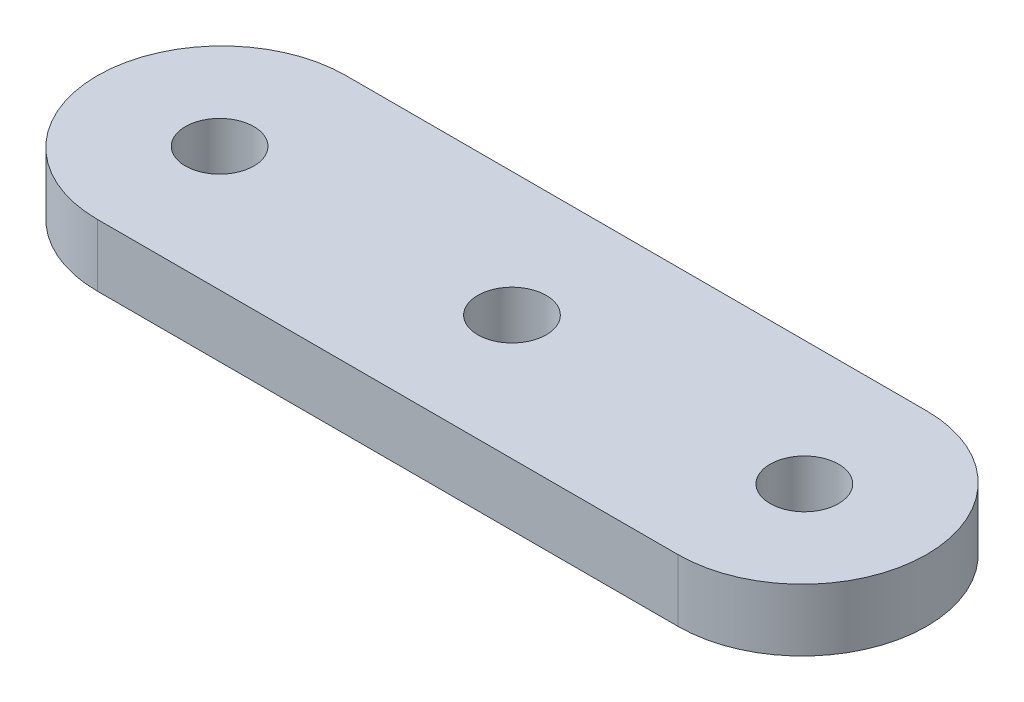
ISO-10303-21;
HEADER;
FILE_DESCRIPTION(('STEP AP214'),'2;1');
FILE_NAME('part.step','',(''),(''),'','','');
FILE_SCHEMA(('AUTOMOTIVE_DESIGN { 1 0 10303 214 1 1 1 1 }'));
ENDSEC;
DATA;
#1=APPLICATION_CONTEXT('core data for automotive mechanical design processes');
#2=APPLICATION_PROTOCOL_DEFINITION('international standard','automotive_design',2000,#1);
#3=PRODUCT_CONTEXT('',#1,'mechanical');
#4=PRODUCT('Part','Part','',(#3));
#5=PRODUCT_RELATED_PRODUCT_CATEGORY('part','',(#4));
#6=PRODUCT_DEFINITION_FORMATION('','',#4);
#7=PRODUCT_DEFINITION_CONTEXT('part definition',#1,'design');
#8=PRODUCT_DEFINITION('design','',#6,#7);
#9=PRODUCT_DEFINITION_SHAPE('','',#8);
#10=(LENGTH_UNIT() NAMED_UNIT(*) SI_UNIT(.MILLI.,.METRE.));
#11=(NAMED_UNIT(*) PLANE_ANGLE_UNIT() SI_UNIT($,.RADIAN.));
#12=(NAMED_UNIT(*) SI_UNIT($,.STERADIAN.) SOLID_ANGLE_UNIT());
#13=UNCERTAINTY_MEASURE_WITH_UNIT(LENGTH_MEASURE(1.E-05),#10,'distance_accuracy_value','');
#14=(GEOMETRIC_REPRESENTATION_CONTEXT(3) GLOBAL_UNCERTAINTY_ASSIGNED_CONTEXT((#13)) GLOBAL_UNIT_ASSIGNED_CONTEXT((#10,
#11,#12)) REPRESENTATION_CONTEXT('',''));
#15=CARTESIAN_POINT('',(0.,0.,0.));
#16=DIRECTION('',(0.,0.,1.));
#17=DIRECTION('',(1.,0.,0.));
#18=AXIS2_PLACEMENT_3D('',#15,#16,#17);
#19=CARTESIAN_POINT('',(14.,-3.,0.));
#20=DIRECTION('',(0.,1.,0.));
#21=DIRECTION('',(0.,0.,1.));
#22=AXIS2_PLACEMENT_3D('',#19,#20,#21);
#23=CYLINDRICAL_SURFACE('',#22,6.);
#24=CARTESIAN_POINT('',(14.,0.,0.));
#25=DIRECTION('',(0.,1.,0.));
#26=DIRECTION('',(0.,0.,1.));
#27=AXIS2_PLACEMENT_3D('',#24,#25,#26);
#28=CIRCLE('',#27,6.);
#29=CARTESIAN_POINT('',(14.,0.,6.));
#30=VERTEX_POINT('',#29);
#31=CARTESIAN_POINT('',(14.,0.,-6.));
#32=VERTEX_POINT('',#31);
#33=EDGE_CURVE('E112',#30,#32,#28,.T.);
#34=ORIENTED_EDGE('',*,*,#33,.F.);
#35=DIRECTION('',(0.,1.,0.));
#36=VECTOR('',#35,1.);
#37=CARTESIAN_POINT('',(14.,-3.,6.));
#38=LINE('',#37,#36);
#39=CARTESIAN_POINT('',(14.,-3.,6.));
#40=VERTEX_POINT('',#39);
#41=EDGE_CURVE('E11',#40,#30,#38,.T.);
#42=ORIENTED_EDGE('',*,*,#41,.F.);
#43=CARTESIAN_POINT('',(14.,-3.,0.));
#44=DIRECTION('',(0.,1.,0.));
#45=DIRECTION('',(0.,0.,1.));
#46=AXIS2_PLACEMENT_3D('',#43,#44,#45);
#47=CIRCLE('',#46,6.);
#48=CARTESIAN_POINT('',(14.,-3.,-6.));
#49=VERTEX_POINT('',#48);
#50=EDGE_CURVE('E105',#40,#49,#47,.T.);
#51=ORIENTED_EDGE('',*,*,#50,.T.);
#52=DIRECTION('',(0.,1.,0.));
#53=VECTOR('',#52,1.);
#54=CARTESIAN_POINT('',(14.,-3.,-6.));
#55=LINE('',#54,#53);
#56=EDGE_CURVE('E50',#49,#32,#55,.T.);
#57=ORIENTED_EDGE('',*,*,#56,.T.);
#58=EDGE_LOOP('',(#34,#42,#51,#57));
#59=FACE_BOUND('',#58,.T.);
#60=ADVANCED_FACE('F47',(#59),#23,.T.);
#61=CARTESIAN_POINT('',(14.,-3.,6.));
#62=DIRECTION('',(0.,0.,1.));
#63=DIRECTION('',(1.,0.,0.));
#64=AXIS2_PLACEMENT_3D('',#61,#62,#63);
#65=PLANE('',#64);
#66=DIRECTION('',(1.,0.,0.));
#67=VECTOR('',#66,1.);
#68=CARTESIAN_POINT('',(14.,0.,6.));
#69=LINE('',#68,#67);
#70=CARTESIAN_POINT('',(-14.,0.,6.));
#71=VERTEX_POINT('',#70);
#72=EDGE_CURVE('E107',#71,#30,#69,.T.);
#73=ORIENTED_EDGE('',*,*,#72,.F.);
#74=DIRECTION('',(0.,1.,0.));
#75=VECTOR('',#74,1.);
#76=CARTESIAN_POINT('',(-14.,-3.,6.));
#77=LINE('',#76,#75);
#78=CARTESIAN_POINT('',(-14.,-3.,6.));
#79=VERTEX_POINT('',#78);
#80=EDGE_CURVE('E56',#79,#71,#77,.T.);
#81=ORIENTED_EDGE('',*,*,#80,.F.);
#82=DIRECTION('',(1.,0.,0.));
#83=VECTOR('',#82,1.);
#84=CARTESIAN_POINT('',(14.,-3.,6.));
#85=LINE('',#84,#83);
#86=EDGE_CURVE('E102',#79,#40,#85,.T.);
#87=ORIENTED_EDGE('',*,*,#86,.T.);
#88=ORIENTED_EDGE('',*,*,#41,.T.);
#89=EDGE_LOOP('',(#73,#81,#87,#88));
#90=FACE_BOUND('',#89,.T.);
#91=ADVANCED_FACE('F123',(#90),#65,.T.);
#92=CARTESIAN_POINT('',(-14.,-3.,0.));
#93=DIRECTION('',(0.,1.,0.));
#94=DIRECTION('',(0.,0.,1.));
#95=AXIS2_PLACEMENT_3D('',#92,#93,#94);
#96=CYLINDRICAL_SURFACE('',#95,6.);
#97=CARTESIAN_POINT('',(-14.,0.,0.));
#98=DIRECTION('',(0.,1.,0.));
#99=DIRECTION('',(0.,0.,1.));
#100=AXIS2_PLACEMENT_3D('',#97,#98,#99);
#101=CIRCLE('',#100,6.);
#102=CARTESIAN_POINT('',(-14.,0.,-6.));
#103=VERTEX_POINT('',#102);
#104=EDGE_CURVE('E97',#103,#71,#101,.T.);
#105=ORIENTED_EDGE('',*,*,#104,.F.);
#106=DIRECTION('',(0.,1.,0.));
#107=VECTOR('',#106,1.);
#108=CARTESIAN_POINT('',(-14.,-3.,-6.));
#109=LINE('',#108,#107);
#110=CARTESIAN_POINT('',(-14.,-3.,-6.));
#111=VERTEX_POINT('',#110);
#112=EDGE_CURVE('E92',#111,#103,#109,.T.);
#113=ORIENTED_EDGE('',*,*,#112,.F.);
#114=CARTESIAN_POINT('',(-14.,-3.,0.));
#115=DIRECTION('',(0.,1.,0.));
#116=DIRECTION('',(0.,0.,1.));
#117=AXIS2_PLACEMENT_3D('',#114,#115,#116);
#118=CIRCLE('',#117,6.);
#119=EDGE_CURVE('E95',#111,#79,#118,.T.);
#120=ORIENTED_EDGE('',*,*,#119,.T.);
#121=ORIENTED_EDGE('',*,*,#80,.T.);
#122=EDGE_LOOP('',(#105,#113,#120,#121));
#123=FACE_BOUND('',#122,.T.);
#124=ADVANCED_FACE('F94',(#123),#96,.T.);
#125=CARTESIAN_POINT('',(14.,-3.,-6.));
#126=DIRECTION('',(0.,0.,-1.));
#127=DIRECTION('',(-1.,0.,0.));
#128=AXIS2_PLACEMENT_3D('',#125,#126,#127);
#129=PLANE('',#128);
#130=DIRECTION('',(-1.,0.,0.));
#131=VECTOR('',#130,1.);
#132=CARTESIAN_POINT('',(14.,0.,-6.));
#133=LINE('',#132,#131);
#134=EDGE_CURVE('E115',#32,#103,#133,.T.);
#135=ORIENTED_EDGE('',*,*,#134,.F.);
#136=ORIENTED_EDGE('',*,*,#56,.F.);
#137=DIRECTION('',(-1.,0.,0.));
#138=VECTOR('',#137,1.);
#139=CARTESIAN_POINT('',(14.,-3.,-6.));
#140=LINE('',#139,#138);
#141=EDGE_CURVE('E101',#49,#111,#140,.T.);
#142=ORIENTED_EDGE('',*,*,#141,.T.);
#143=ORIENTED_EDGE('',*,*,#112,.T.);
#144=EDGE_LOOP('',(#135,#136,#142,#143));
#145=FACE_BOUND('',#144,.T.);
#146=ADVANCED_FACE('F104',(#145),#129,.T.);
#147=CARTESIAN_POINT('',(14.,-3.,0.));
#148=DIRECTION('',(0.,1.,0.));
#149=DIRECTION('',(0.,0.,1.));
#150=AXIS2_PLACEMENT_3D('',#147,#148,#149);
#151=PLANE('',#150);
#152=CARTESIAN_POINT('',(0.,-3.,0.));
#153=DIRECTION('',(0.,1.,0.));
#154=DIRECTION('',(0.,0.,1.));
#155=AXIS2_PLACEMENT_3D('',#152,#153,#154);
#156=CIRCLE('',#155,1.65);
#157=CARTESIAN_POINT('',(0.,-3.,1.65));
#158=VERTEX_POINT('',#157);
#159=EDGE_CURVE('E161',#158,#158,#156,.T.);
#160=ORIENTED_EDGE('',*,*,#159,.T.);
#161=EDGE_LOOP('',(#160));
#162=FACE_BOUND('',#161,.T.);
#163=CARTESIAN_POINT('',(-14.1,-3.,0.));
#164=DIRECTION('',(0.,1.,0.));
#165=DIRECTION('',(0.,0.,1.));
#166=AXIS2_PLACEMENT_3D('',#163,#164,#165);
#167=CIRCLE('',#166,1.65);
#168=CARTESIAN_POINT('',(-14.1,-3.,1.65));
#169=VERTEX_POINT('',#168);
#170=EDGE_CURVE('E171',#169,#169,#167,.T.);
#171=ORIENTED_EDGE('',*,*,#170,.T.);
#172=EDGE_LOOP('',(#171));
#173=FACE_BOUND('',#172,.T.);
#174=CARTESIAN_POINT('',(14.1,-3.,0.));
#175=DIRECTION('',(0.,1.,0.));
#176=DIRECTION('',(0.,0.,1.));
#177=AXIS2_PLACEMENT_3D('',#174,#175,#176);
#178=CIRCLE('',#177,1.65);
#179=CARTESIAN_POINT('',(14.1,-3.,1.65));
#180=VERTEX_POINT('',#179);
#181=EDGE_CURVE('E116',#180,#180,#178,.T.);
#182=ORIENTED_EDGE('',*,*,#181,.T.);
#183=EDGE_LOOP('',(#182));
#184=FACE_BOUND('',#183,.T.);
#185=ORIENTED_EDGE('',*,*,#50,.F.);
#186=ORIENTED_EDGE('',*,*,#86,.F.);
#187=ORIENTED_EDGE('',*,*,#119,.F.);
#188=ORIENTED_EDGE('',*,*,#141,.F.);
#189=EDGE_LOOP('',(#185,#186,#187,#188));
#190=FACE_BOUND('',#189,.T.);
#191=ADVANCED_FACE('F100',(#162,#173,#184,#190),#151,.F.);
#192=CARTESIAN_POINT('',(14.,0.,0.));
#193=DIRECTION('',(0.,1.,0.));
#194=DIRECTION('',(0.,0.,1.));
#195=AXIS2_PLACEMENT_3D('',#192,#193,#194);
#196=PLANE('',#195);
#197=CARTESIAN_POINT('',(0.,0.,0.));
#198=DIRECTION('',(0.,1.,0.));
#199=DIRECTION('',(0.,0.,1.));
#200=AXIS2_PLACEMENT_3D('',#197,#198,#199);
#201=CIRCLE('',#200,1.65);
#202=CARTESIAN_POINT('',(0.,0.,1.65));
#203=VERTEX_POINT('',#202);
#204=EDGE_CURVE('E164',#203,#203,#201,.T.);
#205=ORIENTED_EDGE('',*,*,#204,.F.);
#206=EDGE_LOOP('',(#205));
#207=FACE_BOUND('',#206,.T.);
#208=CARTESIAN_POINT('',(-14.1,0.,0.));
#209=DIRECTION('',(0.,1.,0.));
#210=DIRECTION('',(0.,0.,1.));
#211=AXIS2_PLACEMENT_3D('',#208,#209,#210);
#212=CIRCLE('',#211,1.65);
#213=CARTESIAN_POINT('',(-14.1,0.,1.65));
#214=VERTEX_POINT('',#213);
#215=EDGE_CURVE('E166',#214,#214,#212,.T.);
#216=ORIENTED_EDGE('',*,*,#215,.F.);
#217=EDGE_LOOP('',(#216));
#218=FACE_BOUND('',#217,.T.);
#219=CARTESIAN_POINT('',(14.1,0.,0.));
#220=DIRECTION('',(0.,1.,0.));
#221=DIRECTION('',(0.,0.,1.));
#222=AXIS2_PLACEMENT_3D('',#219,#220,#221);
#223=CIRCLE('',#222,1.65);
#224=CARTESIAN_POINT('',(14.1,0.,1.65));
#225=VERTEX_POINT('',#224);
#226=EDGE_CURVE('E174',#225,#225,#223,.T.);
#227=ORIENTED_EDGE('',*,*,#226,.F.);
#228=EDGE_LOOP('',(#227));
#229=FACE_BOUND('',#228,.T.);
#230=ORIENTED_EDGE('',*,*,#33,.T.);
#231=ORIENTED_EDGE('',*,*,#134,.T.);
#232=ORIENTED_EDGE('',*,*,#104,.T.);
#233=ORIENTED_EDGE('',*,*,#72,.T.);
#234=EDGE_LOOP('',(#230,#231,#232,#233));
#235=FACE_BOUND('',#234,.T.);
#236=ADVANCED_FACE('F122',(#207,#218,#229,#235),#196,.T.);
#237=CARTESIAN_POINT('',(14.1,0.,0.));
#238=DIRECTION('',(0.,1.,0.));
#239=DIRECTION('',(0.,0.,1.));
#240=AXIS2_PLACEMENT_3D('',#237,#238,#239);
#241=CYLINDRICAL_SURFACE('',#240,1.65);
#242=ORIENTED_EDGE('',*,*,#181,.F.);
#243=EDGE_LOOP('',(#242));
#244=FACE_BOUND('',#243,.T.);
#245=ORIENTED_EDGE('',*,*,#226,.T.);
#246=EDGE_LOOP('',(#245));
#247=FACE_BOUND('',#246,.T.);
#248=ADVANCED_FACE('F142',(#244,#247),#241,.F.);
#249=CARTESIAN_POINT('',(-14.1,0.,0.));
#250=DIRECTION('',(0.,1.,0.));
#251=DIRECTION('',(0.,0.,1.));
#252=AXIS2_PLACEMENT_3D('',#249,#250,#251);
#253=CYLINDRICAL_SURFACE('',#252,1.65);
#254=ORIENTED_EDGE('',*,*,#170,.F.);
#255=EDGE_LOOP('',(#254));
#256=FACE_BOUND('',#255,.T.);
#257=ORIENTED_EDGE('',*,*,#215,.T.);
#258=EDGE_LOOP('',(#257));
#259=FACE_BOUND('',#258,.T.);
#260=ADVANCED_FACE('F149',(#256,#259),#253,.F.);
#261=CARTESIAN_POINT('',(0.,0.,0.));
#262=DIRECTION('',(0.,1.,0.));
#263=DIRECTION('',(0.,0.,1.));
#264=AXIS2_PLACEMENT_3D('',#261,#262,#263);
#265=CYLINDRICAL_SURFACE('',#264,1.65);
#266=ORIENTED_EDGE('',*,*,#159,.F.);
#267=EDGE_LOOP('',(#266));
#268=FACE_BOUND('',#267,.T.);
#269=ORIENTED_EDGE('',*,*,#204,.T.);
#270=EDGE_LOOP('',(#269));
#271=FACE_BOUND('',#270,.T.);
#272=ADVANCED_FACE('F153',(#268,#271),#265,.F.);
#273=CLOSED_SHELL('',(#60,#91,#124,#146,#191,#236,#248,#260,#272));
#274=MANIFOLD_SOLID_BREP('B2',#273);
#275=ADVANCED_BREP_SHAPE_REPRESENTATION('',(#18,#274),#14);
#276=SHAPE_DEFINITION_REPRESENTATION(#9,#275);
ENDSEC;
END-ISO-10303-21;
